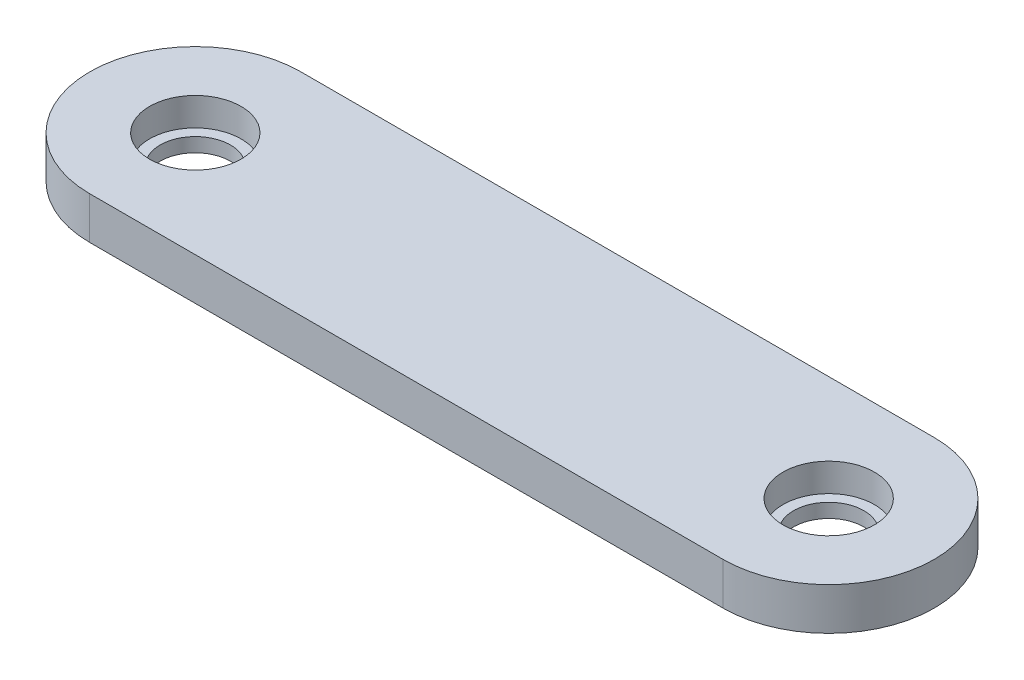
ISO-10303-21;
HEADER;
FILE_DESCRIPTION(('STEP AP214'),'2;1');
FILE_NAME('part.step','',(''),(''),'','','');
FILE_SCHEMA(('AUTOMOTIVE_DESIGN { 1 0 10303 214 1 1 1 1 }'));
ENDSEC;
DATA;
#1=APPLICATION_CONTEXT('core data for automotive mechanical design processes');
#2=APPLICATION_PROTOCOL_DEFINITION('international standard','automotive_design',2000,#1);
#3=PRODUCT_CONTEXT('',#1,'mechanical');
#4=PRODUCT('Part','Part','',(#3));
#5=PRODUCT_RELATED_PRODUCT_CATEGORY('part','',(#4));
#6=PRODUCT_DEFINITION_FORMATION('','',#4);
#7=PRODUCT_DEFINITION_CONTEXT('part definition',#1,'design');
#8=PRODUCT_DEFINITION('design','',#6,#7);
#9=PRODUCT_DEFINITION_SHAPE('','',#8);
#10=(LENGTH_UNIT() NAMED_UNIT(*) SI_UNIT(.MILLI.,.METRE.));
#11=(NAMED_UNIT(*) PLANE_ANGLE_UNIT() SI_UNIT($,.RADIAN.));
#12=(NAMED_UNIT(*) SI_UNIT($,.STERADIAN.) SOLID_ANGLE_UNIT());
#13=UNCERTAINTY_MEASURE_WITH_UNIT(LENGTH_MEASURE(1.E-05),#10,'distance_accuracy_value','');
#14=(GEOMETRIC_REPRESENTATION_CONTEXT(3) GLOBAL_UNCERTAINTY_ASSIGNED_CONTEXT((#13)) GLOBAL_UNIT_ASSIGNED_CONTEXT((#10,
#11,#12)) REPRESENTATION_CONTEXT('',''));
#15=CARTESIAN_POINT('',(0.,0.,0.));
#16=DIRECTION('',(0.,0.,1.));
#17=DIRECTION('',(1.,0.,0.));
#18=AXIS2_PLACEMENT_3D('',#15,#16,#17);
#19=CARTESIAN_POINT('',(-45.,6.,0.));
#20=DIRECTION('',(0.,-1.,0.));
#21=DIRECTION('',(0.,0.,-1.));
#22=AXIS2_PLACEMENT_3D('',#19,#20,#21);
#23=CYLINDRICAL_SURFACE('',#22,5.);
#24=CARTESIAN_POINT('',(-45.,0.,0.));
#25=DIRECTION('',(0.,1.,0.));
#26=DIRECTION('',(0.,0.,1.));
#27=AXIS2_PLACEMENT_3D('',#24,#25,#26);
#28=CIRCLE('',#27,5.);
#29=CARTESIAN_POINT('',(-45.,0.,5.));
#30=VERTEX_POINT('',#29);
#31=EDGE_CURVE('E114',#30,#30,#28,.T.);
#32=ORIENTED_EDGE('',*,*,#31,.F.);
#33=EDGE_LOOP('',(#32));
#34=FACE_BOUND('',#33,.T.);
#35=CARTESIAN_POINT('',(-45.,2.,0.));
#36=DIRECTION('',(0.,1.,0.));
#37=DIRECTION('',(0.,0.,1.));
#38=AXIS2_PLACEMENT_3D('',#35,#36,#37);
#39=CIRCLE('',#38,5.);
#40=CARTESIAN_POINT('',(-45.,2.,5.));
#41=VERTEX_POINT('',#40);
#42=EDGE_CURVE('E42',#41,#41,#39,.T.);
#43=ORIENTED_EDGE('',*,*,#42,.T.);
#44=EDGE_LOOP('',(#43));
#45=FACE_BOUND('',#44,.T.);
#46=ADVANCED_FACE('F38',(#34,#45),#23,.F.);
#47=CARTESIAN_POINT('',(45.,6.,0.));
#48=DIRECTION('',(0.,-1.,0.));
#49=DIRECTION('',(0.,0.,-1.));
#50=AXIS2_PLACEMENT_3D('',#47,#48,#49);
#51=CYLINDRICAL_SURFACE('',#50,5.);
#52=CARTESIAN_POINT('',(45.,0.,0.));
#53=DIRECTION('',(0.,1.,0.));
#54=DIRECTION('',(0.,0.,1.));
#55=AXIS2_PLACEMENT_3D('',#52,#53,#54);
#56=CIRCLE('',#55,5.);
#57=CARTESIAN_POINT('',(45.,0.,5.));
#58=VERTEX_POINT('',#57);
#59=EDGE_CURVE('E133',#58,#58,#56,.T.);
#60=ORIENTED_EDGE('',*,*,#59,.F.);
#61=EDGE_LOOP('',(#60));
#62=FACE_BOUND('',#61,.T.);
#63=CARTESIAN_POINT('',(45.,2.,0.));
#64=DIRECTION('',(0.,1.,0.));
#65=DIRECTION('',(0.,0.,1.));
#66=AXIS2_PLACEMENT_3D('',#63,#64,#65);
#67=CIRCLE('',#66,5.);
#68=CARTESIAN_POINT('',(45.,2.,5.));
#69=VERTEX_POINT('',#68);
#70=EDGE_CURVE('E124',#69,#69,#67,.T.);
#71=ORIENTED_EDGE('',*,*,#70,.T.);
#72=EDGE_LOOP('',(#71));
#73=FACE_BOUND('',#72,.T.);
#74=ADVANCED_FACE('F164',(#62,#73),#51,.F.);
#75=CARTESIAN_POINT('',(45.,6.,0.));
#76=DIRECTION('',(0.,1.,0.));
#77=DIRECTION('',(0.,0.,1.));
#78=AXIS2_PLACEMENT_3D('',#75,#76,#77);
#79=PLANE('',#78);
#80=CARTESIAN_POINT('',(-45.,6.,0.));
#81=DIRECTION('',(0.,1.,0.));
#82=DIRECTION('',(0.,0.,1.));
#83=AXIS2_PLACEMENT_3D('',#80,#81,#82);
#84=CIRCLE('',#83,6.5);
#85=CARTESIAN_POINT('',(-45.,6.,6.5));
#86=VERTEX_POINT('',#85);
#87=EDGE_CURVE('E135',#86,#86,#84,.T.);
#88=ORIENTED_EDGE('',*,*,#87,.F.);
#89=EDGE_LOOP('',(#88));
#90=FACE_BOUND('',#89,.T.);
#91=CARTESIAN_POINT('',(45.,6.,0.));
#92=DIRECTION('',(0.,1.,0.));
#93=DIRECTION('',(0.,0.,1.));
#94=AXIS2_PLACEMENT_3D('',#91,#92,#93);
#95=CIRCLE('',#94,6.5);
#96=CARTESIAN_POINT('',(45.,6.,6.5));
#97=VERTEX_POINT('',#96);
#98=EDGE_CURVE('E147',#97,#97,#95,.T.);
#99=ORIENTED_EDGE('',*,*,#98,.F.);
#100=EDGE_LOOP('',(#99));
#101=FACE_BOUND('',#100,.T.);
#102=CARTESIAN_POINT('',(45.,6.,0.));
#103=DIRECTION('',(0.,1.,0.));
#104=DIRECTION('',(0.,0.,1.));
#105=AXIS2_PLACEMENT_3D('',#102,#103,#104);
#106=CIRCLE('',#105,15.);
#107=CARTESIAN_POINT('',(45.,6.,15.));
#108=VERTEX_POINT('',#107);
#109=CARTESIAN_POINT('',(45.,6.,-15.));
#110=VERTEX_POINT('',#109);
#111=EDGE_CURVE('E93',#108,#110,#106,.T.);
#112=ORIENTED_EDGE('',*,*,#111,.T.);
#113=DIRECTION('',(-1.,0.,0.));
#114=VECTOR('',#113,1.);
#115=CARTESIAN_POINT('',(-45.,6.,-15.));
#116=LINE('',#115,#114);
#117=CARTESIAN_POINT('',(-45.,6.,-15.));
#118=VERTEX_POINT('',#117);
#119=EDGE_CURVE('E88',#110,#118,#116,.T.);
#120=ORIENTED_EDGE('',*,*,#119,.T.);
#121=CARTESIAN_POINT('',(-45.,6.,0.));
#122=DIRECTION('',(0.,1.,0.));
#123=DIRECTION('',(0.,0.,1.));
#124=AXIS2_PLACEMENT_3D('',#121,#122,#123);
#125=CIRCLE('',#124,15.);
#126=CARTESIAN_POINT('',(-45.,6.,15.));
#127=VERTEX_POINT('',#126);
#128=EDGE_CURVE('E91',#118,#127,#125,.T.);
#129=ORIENTED_EDGE('',*,*,#128,.T.);
#130=DIRECTION('',(1.,0.,0.));
#131=VECTOR('',#130,1.);
#132=CARTESIAN_POINT('',(-45.,6.,15.));
#133=LINE('',#132,#131);
#134=EDGE_CURVE('E58',#127,#108,#133,.T.);
#135=ORIENTED_EDGE('',*,*,#134,.T.);
#136=EDGE_LOOP('',(#112,#120,#129,#135));
#137=FACE_BOUND('',#136,.T.);
#138=ADVANCED_FACE('F89',(#90,#101,#137),#79,.T.);
#139=CARTESIAN_POINT('',(45.,0.,0.));
#140=DIRECTION('',(0.,1.,0.));
#141=DIRECTION('',(0.,0.,1.));
#142=AXIS2_PLACEMENT_3D('',#139,#140,#141);
#143=PLANE('',#142);
#144=CARTESIAN_POINT('',(45.,0.,0.));
#145=DIRECTION('',(0.,1.,0.));
#146=DIRECTION('',(0.,0.,1.));
#147=AXIS2_PLACEMENT_3D('',#144,#145,#146);
#148=CIRCLE('',#147,15.);
#149=CARTESIAN_POINT('',(45.,0.,15.));
#150=VERTEX_POINT('',#149);
#151=CARTESIAN_POINT('',(45.,0.,-15.));
#152=VERTEX_POINT('',#151);
#153=EDGE_CURVE('E110',#150,#152,#148,.T.);
#154=ORIENTED_EDGE('',*,*,#153,.F.);
#155=DIRECTION('',(1.,0.,0.));
#156=VECTOR('',#155,1.);
#157=CARTESIAN_POINT('',(-45.,0.,15.));
#158=LINE('',#157,#156);
#159=CARTESIAN_POINT('',(-45.,0.,15.));
#160=VERTEX_POINT('',#159);
#161=EDGE_CURVE('E81',#160,#150,#158,.T.);
#162=ORIENTED_EDGE('',*,*,#161,.F.);
#163=CARTESIAN_POINT('',(-45.,0.,0.));
#164=DIRECTION('',(0.,1.,0.));
#165=DIRECTION('',(0.,0.,1.));
#166=AXIS2_PLACEMENT_3D('',#163,#164,#165);
#167=CIRCLE('',#166,15.);
#168=CARTESIAN_POINT('',(-45.,0.,-15.));
#169=VERTEX_POINT('',#168);
#170=EDGE_CURVE('E75',#169,#160,#167,.T.);
#171=ORIENTED_EDGE('',*,*,#170,.F.);
#172=DIRECTION('',(-1.,0.,0.));
#173=VECTOR('',#172,1.);
#174=CARTESIAN_POINT('',(-45.,0.,-15.));
#175=LINE('',#174,#173);
#176=EDGE_CURVE('E98',#152,#169,#175,.T.);
#177=ORIENTED_EDGE('',*,*,#176,.F.);
#178=EDGE_LOOP('',(#154,#162,#171,#177));
#179=FACE_BOUND('',#178,.T.);
#180=ORIENTED_EDGE('',*,*,#31,.T.);
#181=EDGE_LOOP('',(#180));
#182=FACE_BOUND('',#181,.T.);
#183=ORIENTED_EDGE('',*,*,#59,.T.);
#184=EDGE_LOOP('',(#183));
#185=FACE_BOUND('',#184,.T.);
#186=ADVANCED_FACE('F159',(#179,#182,#185),#143,.F.);
#187=CARTESIAN_POINT('',(45.,6.,0.));
#188=DIRECTION('',(0.,-1.,0.));
#189=DIRECTION('',(0.,0.,-1.));
#190=AXIS2_PLACEMENT_3D('',#187,#188,#189);
#191=CYLINDRICAL_SURFACE('',#190,15.);
#192=ORIENTED_EDGE('',*,*,#153,.T.);
#193=DIRECTION('',(0.,-1.,0.));
#194=VECTOR('',#193,1.);
#195=CARTESIAN_POINT('',(45.,6.,-15.));
#196=LINE('',#195,#194);
#197=EDGE_CURVE('E11',#110,#152,#196,.T.);
#198=ORIENTED_EDGE('',*,*,#197,.F.);
#199=ORIENTED_EDGE('',*,*,#111,.F.);
#200=DIRECTION('',(0.,-1.,0.));
#201=VECTOR('',#200,1.);
#202=CARTESIAN_POINT('',(45.,6.,15.));
#203=LINE('',#202,#201);
#204=EDGE_CURVE('E106',#108,#150,#203,.T.);
#205=ORIENTED_EDGE('',*,*,#204,.T.);
#206=EDGE_LOOP('',(#192,#198,#199,#205));
#207=FACE_BOUND('',#206,.T.);
#208=ADVANCED_FACE('F40',(#207),#191,.T.);
#209=CARTESIAN_POINT('',(-45.,6.,-15.));
#210=DIRECTION('',(0.,0.,1.));
#211=DIRECTION('',(1.,0.,0.));
#212=AXIS2_PLACEMENT_3D('',#209,#210,#211);
#213=PLANE('',#212);
#214=ORIENTED_EDGE('',*,*,#176,.T.);
#215=DIRECTION('',(0.,-1.,0.));
#216=VECTOR('',#215,1.);
#217=CARTESIAN_POINT('',(-45.,6.,-15.));
#218=LINE('',#217,#216);
#219=EDGE_CURVE('E49',#118,#169,#218,.T.);
#220=ORIENTED_EDGE('',*,*,#219,.F.);
#221=ORIENTED_EDGE('',*,*,#119,.F.);
#222=ORIENTED_EDGE('',*,*,#197,.T.);
#223=EDGE_LOOP('',(#214,#220,#221,#222));
#224=FACE_BOUND('',#223,.T.);
#225=ADVANCED_FACE('F97',(#224),#213,.F.);
#226=CARTESIAN_POINT('',(-45.,6.,0.));
#227=DIRECTION('',(0.,-1.,0.));
#228=DIRECTION('',(0.,0.,-1.));
#229=AXIS2_PLACEMENT_3D('',#226,#227,#228);
#230=CYLINDRICAL_SURFACE('',#229,15.);
#231=ORIENTED_EDGE('',*,*,#170,.T.);
#232=DIRECTION('',(0.,-1.,0.));
#233=VECTOR('',#232,1.);
#234=CARTESIAN_POINT('',(-45.,6.,15.));
#235=LINE('',#234,#233);
#236=EDGE_CURVE('E100',#127,#160,#235,.T.);
#237=ORIENTED_EDGE('',*,*,#236,.F.);
#238=ORIENTED_EDGE('',*,*,#128,.F.);
#239=ORIENTED_EDGE('',*,*,#219,.T.);
#240=EDGE_LOOP('',(#231,#237,#238,#239));
#241=FACE_BOUND('',#240,.T.);
#242=ADVANCED_FACE('F102',(#241),#230,.T.);
#243=CARTESIAN_POINT('',(-45.,6.,15.));
#244=DIRECTION('',(0.,0.,-1.));
#245=DIRECTION('',(-1.,0.,0.));
#246=AXIS2_PLACEMENT_3D('',#243,#244,#245);
#247=PLANE('',#246);
#248=ORIENTED_EDGE('',*,*,#161,.T.);
#249=ORIENTED_EDGE('',*,*,#204,.F.);
#250=ORIENTED_EDGE('',*,*,#134,.F.);
#251=ORIENTED_EDGE('',*,*,#236,.T.);
#252=EDGE_LOOP('',(#248,#249,#250,#251));
#253=FACE_BOUND('',#252,.T.);
#254=ADVANCED_FACE('F185',(#253),#247,.F.);
#255=CARTESIAN_POINT('',(45.,2.,0.));
#256=DIRECTION('',(0.,1.,0.));
#257=DIRECTION('',(0.,0.,1.));
#258=AXIS2_PLACEMENT_3D('',#255,#256,#257);
#259=CYLINDRICAL_SURFACE('',#258,6.5);
#260=CARTESIAN_POINT('',(45.,2.,0.));
#261=DIRECTION('',(0.,1.,0.));
#262=DIRECTION('',(0.,0.,1.));
#263=AXIS2_PLACEMENT_3D('',#260,#261,#262);
#264=CIRCLE('',#263,6.5);
#265=CARTESIAN_POINT('',(45.,2.,6.5));
#266=VERTEX_POINT('',#265);
#267=EDGE_CURVE('E141',#266,#266,#264,.T.);
#268=ORIENTED_EDGE('',*,*,#267,.F.);
#269=EDGE_LOOP('',(#268));
#270=FACE_BOUND('',#269,.T.);
#271=ORIENTED_EDGE('',*,*,#98,.T.);
#272=EDGE_LOOP('',(#271));
#273=FACE_BOUND('',#272,.T.);
#274=ADVANCED_FACE('F181',(#270,#273),#259,.F.);
#275=CARTESIAN_POINT('',(45.,2.,0.));
#276=DIRECTION('',(0.,1.,0.));
#277=DIRECTION('',(0.,0.,1.));
#278=AXIS2_PLACEMENT_3D('',#275,#276,#277);
#279=PLANE('',#278);
#280=ORIENTED_EDGE('',*,*,#70,.F.);
#281=EDGE_LOOP('',(#280));
#282=FACE_BOUND('',#281,.T.);
#283=ORIENTED_EDGE('',*,*,#267,.T.);
#284=EDGE_LOOP('',(#283));
#285=FACE_BOUND('',#284,.T.);
#286=ADVANCED_FACE('F175',(#282,#285),#279,.T.);
#287=CARTESIAN_POINT('',(-45.,2.,0.));
#288=DIRECTION('',(0.,1.,0.));
#289=DIRECTION('',(0.,0.,1.));
#290=AXIS2_PLACEMENT_3D('',#287,#288,#289);
#291=CYLINDRICAL_SURFACE('',#290,6.5);
#292=CARTESIAN_POINT('',(-45.,2.,0.));
#293=DIRECTION('',(0.,1.,0.));
#294=DIRECTION('',(0.,0.,1.));
#295=AXIS2_PLACEMENT_3D('',#292,#293,#294);
#296=CIRCLE('',#295,6.5);
#297=CARTESIAN_POINT('',(-45.,2.,6.5));
#298=VERTEX_POINT('',#297);
#299=EDGE_CURVE('E127',#298,#298,#296,.T.);
#300=ORIENTED_EDGE('',*,*,#299,.F.);
#301=EDGE_LOOP('',(#300));
#302=FACE_BOUND('',#301,.T.);
#303=ORIENTED_EDGE('',*,*,#87,.T.);
#304=EDGE_LOOP('',(#303));
#305=FACE_BOUND('',#304,.T.);
#306=ADVANCED_FACE('F170',(#302,#305),#291,.F.);
#307=CARTESIAN_POINT('',(-45.,2.,0.));
#308=DIRECTION('',(0.,1.,0.));
#309=DIRECTION('',(0.,0.,1.));
#310=AXIS2_PLACEMENT_3D('',#307,#308,#309);
#311=PLANE('',#310);
#312=ORIENTED_EDGE('',*,*,#42,.F.);
#313=EDGE_LOOP('',(#312));
#314=FACE_BOUND('',#313,.T.);
#315=ORIENTED_EDGE('',*,*,#299,.T.);
#316=EDGE_LOOP('',(#315));
#317=FACE_BOUND('',#316,.T.);
#318=ADVANCED_FACE('F168',(#314,#317),#311,.T.);
#319=CLOSED_SHELL('',(#46,#74,#138,#186,#208,#225,#242,#254,#274,#286,#306,#318));
#320=MANIFOLD_SOLID_BREP('B2',#319);
#321=ADVANCED_BREP_SHAPE_REPRESENTATION('',(#18,#320),#14);
#322=SHAPE_DEFINITION_REPRESENTATION(#9,#321);
ENDSEC;
END-ISO-10303-21;
